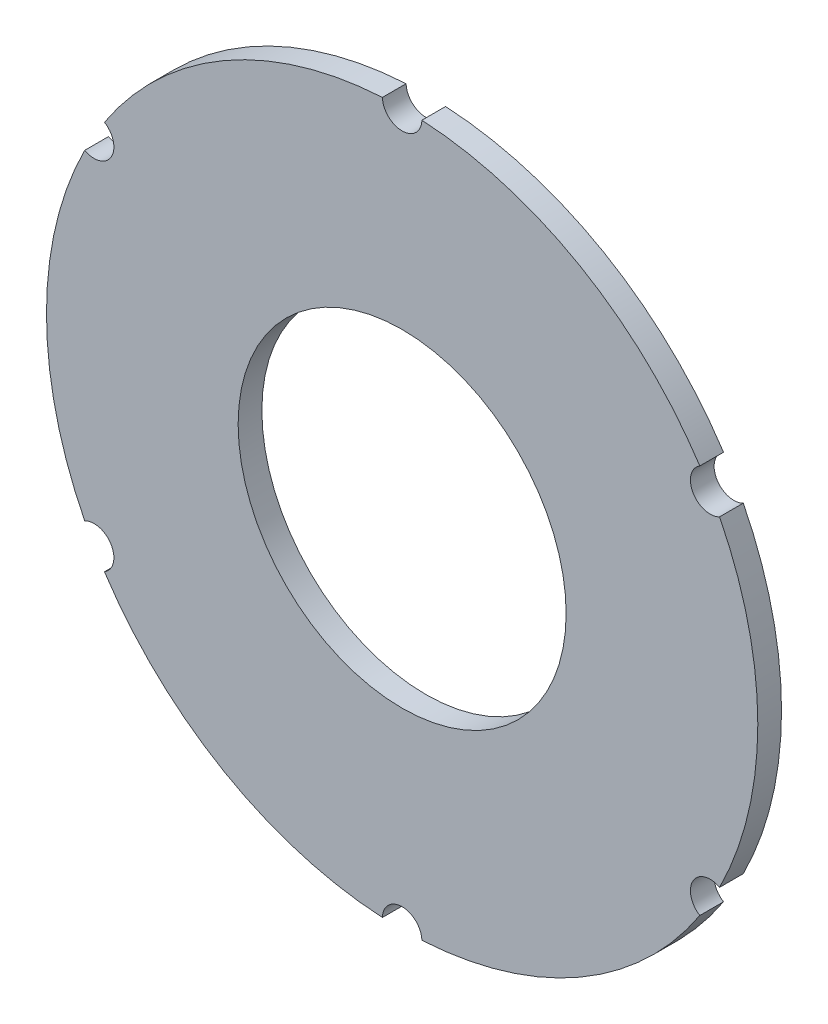
ISO-10303-21;
HEADER;
FILE_DESCRIPTION(('STEP AP214'),'2;1');
FILE_NAME('part.step','',(''),(''),'','','');
FILE_SCHEMA(('AUTOMOTIVE_DESIGN { 1 0 10303 214 1 1 1 1 }'));
ENDSEC;
DATA;
#1=APPLICATION_CONTEXT('core data for automotive mechanical design processes');
#2=APPLICATION_PROTOCOL_DEFINITION('international standard','automotive_design',2000,#1);
#3=PRODUCT_CONTEXT('',#1,'mechanical');
#4=PRODUCT('Part','Part','',(#3));
#5=PRODUCT_RELATED_PRODUCT_CATEGORY('part','',(#4));
#6=PRODUCT_DEFINITION_FORMATION('','',#4);
#7=PRODUCT_DEFINITION_CONTEXT('part definition',#1,'design');
#8=PRODUCT_DEFINITION('design','',#6,#7);
#9=PRODUCT_DEFINITION_SHAPE('','',#8);
#10=(LENGTH_UNIT() NAMED_UNIT(*) SI_UNIT(.MILLI.,.METRE.));
#11=(NAMED_UNIT(*) PLANE_ANGLE_UNIT() SI_UNIT($,.RADIAN.));
#12=(NAMED_UNIT(*) SI_UNIT($,.STERADIAN.) SOLID_ANGLE_UNIT());
#13=UNCERTAINTY_MEASURE_WITH_UNIT(LENGTH_MEASURE(1.E-05),#10,'distance_accuracy_value','');
#14=(GEOMETRIC_REPRESENTATION_CONTEXT(3) GLOBAL_UNCERTAINTY_ASSIGNED_CONTEXT((#13)) GLOBAL_UNIT_ASSIGNED_CONTEXT((#10,
#11,#12)) REPRESENTATION_CONTEXT('',''));
#15=CARTESIAN_POINT('',(0.,0.,0.));
#16=DIRECTION('',(0.,0.,1.));
#17=DIRECTION('',(1.,0.,0.));
#18=AXIS2_PLACEMENT_3D('',#15,#16,#17);
#19=CARTESIAN_POINT('',(0.,0.,0.));
#20=DIRECTION('',(0.,0.,1.));
#21=DIRECTION('',(1.,0.,0.));
#22=AXIS2_PLACEMENT_3D('',#19,#20,#21);
#23=PLANE('',#22);
#24=CARTESIAN_POINT('',(0.,0.,0.));
#25=DIRECTION('',(0.,0.,1.));
#26=DIRECTION('',(1.,0.,0.));
#27=AXIS2_PLACEMENT_3D('',#24,#25,#26);
#28=CIRCLE('',#27,41.5);
#29=CARTESIAN_POINT('',(41.5,0.,0.));
#30=VERTEX_POINT('',#29);
#31=EDGE_CURVE('E206',#30,#30,#28,.T.);
#32=ORIENTED_EDGE('',*,*,#31,.T.);
#33=EDGE_LOOP('',(#32));
#34=FACE_BOUND('',#33,.T.);
#35=CARTESIAN_POINT('',(77.9422863405996,44.9999999999998,0.));
#36=DIRECTION('',(0.,0.,-1.));
#37=DIRECTION('',(-1.,0.,0.));
#38=AXIS2_PLACEMENT_3D('',#35,#36,#37);
#39=CIRCLE('',#38,5.);
#40=CARTESIAN_POINT('',(80.3210403422193,40.6020994327089,0.));
#41=VERTEX_POINT('',#40);
#42=CARTESIAN_POINT('',(75.3229697268175,49.2590116784019,0.));
#43=VERTEX_POINT('',#42);
#44=EDGE_CURVE('E48',#41,#43,#39,.T.);
#45=ORIENTED_EDGE('',*,*,#44,.F.);
#46=CARTESIAN_POINT('',(0.,0.,0.));
#47=DIRECTION('',(0.,0.,1.));
#48=DIRECTION('',(1.,0.,0.));
#49=AXIS2_PLACEMENT_3D('',#46,#47,#48);
#50=CIRCLE('',#49,90.);
#51=CARTESIAN_POINT('',(80.3210403422193,-40.6020994327088,0.));
#52=VERTEX_POINT('',#51);
#53=EDGE_CURVE('E129',#52,#41,#50,.T.);
#54=ORIENTED_EDGE('',*,*,#53,.F.);
#55=CARTESIAN_POINT('',(77.9422863405996,-44.9999999999998,0.));
#56=DIRECTION('',(0.,0.,-1.));
#57=DIRECTION('',(-1.,0.,0.));
#58=AXIS2_PLACEMENT_3D('',#55,#56,#57);
#59=CIRCLE('',#58,5.);
#60=CARTESIAN_POINT('',(75.3229697268175,-49.2590116784019,0.));
#61=VERTEX_POINT('',#60);
#62=EDGE_CURVE('E56',#61,#52,#59,.T.);
#63=ORIENTED_EDGE('',*,*,#62,.F.);
#64=CARTESIAN_POINT('',(4.9980706154018,-89.8611111111111,0.));
#65=VERTEX_POINT('',#64);
#66=EDGE_CURVE('E135',#65,#61,#50,.T.);
#67=ORIENTED_EDGE('',*,*,#66,.F.);
#68=CARTESIAN_POINT('',(0.,-90.,0.));
#69=DIRECTION('',(0.,0.,-1.));
#70=DIRECTION('',(-1.,0.,0.));
#71=AXIS2_PLACEMENT_3D('',#68,#69,#70);
#72=CIRCLE('',#71,5.);
#73=CARTESIAN_POINT('',(-4.99807061540183,-89.8611111111111,0.));
#74=VERTEX_POINT('',#73);
#75=EDGE_CURVE('E190',#74,#65,#72,.T.);
#76=ORIENTED_EDGE('',*,*,#75,.F.);
#77=CARTESIAN_POINT('',(-75.3229697268175,-49.2590116784019,0.));
#78=VERTEX_POINT('',#77);
#79=EDGE_CURVE('E138',#78,#74,#50,.T.);
#80=ORIENTED_EDGE('',*,*,#79,.F.);
#81=CARTESIAN_POINT('',(-77.9422863405996,-44.9999999999998,0.));
#82=DIRECTION('',(0.,0.,-1.));
#83=DIRECTION('',(-1.,0.,0.));
#84=AXIS2_PLACEMENT_3D('',#81,#82,#83);
#85=CIRCLE('',#84,5.);
#86=CARTESIAN_POINT('',(-80.3210403422193,-40.6020994327088,0.));
#87=VERTEX_POINT('',#86);
#88=EDGE_CURVE('E194',#87,#78,#85,.T.);
#89=ORIENTED_EDGE('',*,*,#88,.F.);
#90=CARTESIAN_POINT('',(-80.3210403422193,40.6020994327089,0.));
#91=VERTEX_POINT('',#90);
#92=EDGE_CURVE('E145',#91,#87,#50,.T.);
#93=ORIENTED_EDGE('',*,*,#92,.F.);
#94=CARTESIAN_POINT('',(-77.9422863405996,44.9999999999998,0.));
#95=DIRECTION('',(0.,0.,-1.));
#96=DIRECTION('',(-1.,0.,0.));
#97=AXIS2_PLACEMENT_3D('',#94,#95,#96);
#98=CIRCLE('',#97,5.);
#99=CARTESIAN_POINT('',(-75.3229697268175,49.2590116784019,0.));
#100=VERTEX_POINT('',#99);
#101=EDGE_CURVE('E198',#100,#91,#98,.T.);
#102=ORIENTED_EDGE('',*,*,#101,.F.);
#103=CARTESIAN_POINT('',(-4.99807061540181,89.8611111111111,0.));
#104=VERTEX_POINT('',#103);
#105=EDGE_CURVE('E140',#104,#100,#50,.T.);
#106=ORIENTED_EDGE('',*,*,#105,.F.);
#107=CARTESIAN_POINT('',(0.,90.,0.));
#108=DIRECTION('',(0.,0.,-1.));
#109=DIRECTION('',(-1.,0.,0.));
#110=AXIS2_PLACEMENT_3D('',#107,#108,#109);
#111=CIRCLE('',#110,5.);
#112=CARTESIAN_POINT('',(4.99807061540184,89.8611111111111,0.));
#113=VERTEX_POINT('',#112);
#114=EDGE_CURVE('E202',#113,#104,#111,.T.);
#115=ORIENTED_EDGE('',*,*,#114,.F.);
#116=EDGE_CURVE('E131',#43,#113,#50,.T.);
#117=ORIENTED_EDGE('',*,*,#116,.F.);
#118=EDGE_LOOP('',(#45,#54,#63,#67,#76,#80,#89,#93,#102,#106,#115,#117));
#119=FACE_BOUND('',#118,.T.);
#120=ADVANCED_FACE('F33',(#34,#119),#23,.F.);
#121=CARTESIAN_POINT('',(0.,0.,6.));
#122=DIRECTION('',(0.,0.,-1.));
#123=DIRECTION('',(-1.,0.,0.));
#124=AXIS2_PLACEMENT_3D('',#121,#122,#123);
#125=CYLINDRICAL_SURFACE('',#124,90.);
#126=ORIENTED_EDGE('',*,*,#53,.T.);
#127=DIRECTION('',(0.,0.,-1.));
#128=VECTOR('',#127,1.);
#129=CARTESIAN_POINT('',(80.3210403422193,40.6020994327089,4.953));
#130=LINE('',#129,#128);
#131=CARTESIAN_POINT('',(80.3210403422193,40.6020994327088,6.));
#132=VERTEX_POINT('',#131);
#133=EDGE_CURVE('E11',#41,#132,#130,.F.);
#134=ORIENTED_EDGE('',*,*,#133,.T.);
#135=CARTESIAN_POINT('',(0.,0.,6.));
#136=DIRECTION('',(0.,0.,1.));
#137=DIRECTION('',(1.,0.,0.));
#138=AXIS2_PLACEMENT_3D('',#135,#136,#137);
#139=CIRCLE('',#138,90.);
#140=CARTESIAN_POINT('',(80.3210403422193,-40.6020994327088,6.));
#141=VERTEX_POINT('',#140);
#142=EDGE_CURVE('E184',#141,#132,#139,.T.);
#143=ORIENTED_EDGE('',*,*,#142,.F.);
#144=DIRECTION('',(0.,0.,-1.));
#145=VECTOR('',#144,1.);
#146=CARTESIAN_POINT('',(80.3210403422193,-40.6020994327088,4.953));
#147=LINE('',#146,#145);
#148=EDGE_CURVE('E134',#141,#52,#147,.T.);
#149=ORIENTED_EDGE('',*,*,#148,.T.);
#150=EDGE_LOOP('',(#126,#134,#143,#149));
#151=FACE_BOUND('',#150,.T.);
#152=ADVANCED_FACE('F133',(#151),#125,.T.);
#153=ORIENTED_EDGE('',*,*,#66,.T.);
#154=DIRECTION('',(0.,0.,-1.));
#155=VECTOR('',#154,1.);
#156=CARTESIAN_POINT('',(75.3229697268175,-49.2590116784019,4.953));
#157=LINE('',#156,#155);
#158=CARTESIAN_POINT('',(75.3229697268175,-49.2590116784019,6.));
#159=VERTEX_POINT('',#158);
#160=EDGE_CURVE('E173',#61,#159,#157,.F.);
#161=ORIENTED_EDGE('',*,*,#160,.T.);
#162=CARTESIAN_POINT('',(4.9980706154018,-89.8611111111111,6.));
#163=VERTEX_POINT('',#162);
#164=EDGE_CURVE('E257',#163,#159,#139,.T.);
#165=ORIENTED_EDGE('',*,*,#164,.F.);
#166=DIRECTION('',(0.,0.,-1.));
#167=VECTOR('',#166,1.);
#168=CARTESIAN_POINT('',(4.99807061540183,-89.8611111111111,4.953));
#169=LINE('',#168,#167);
#170=EDGE_CURVE('E166',#163,#65,#169,.T.);
#171=ORIENTED_EDGE('',*,*,#170,.T.);
#172=EDGE_LOOP('',(#153,#161,#165,#171));
#173=FACE_BOUND('',#172,.T.);
#174=ADVANCED_FACE('F230',(#173),#125,.T.);
#175=ORIENTED_EDGE('',*,*,#79,.T.);
#176=DIRECTION('',(0.,0.,-1.));
#177=VECTOR('',#176,1.);
#178=CARTESIAN_POINT('',(-4.99807061540183,-89.8611111111111,4.953));
#179=LINE('',#178,#177);
#180=CARTESIAN_POINT('',(-4.99807061540189,-89.8611111111111,6.));
#181=VERTEX_POINT('',#180);
#182=EDGE_CURVE('E169',#74,#181,#179,.F.);
#183=ORIENTED_EDGE('',*,*,#182,.T.);
#184=CARTESIAN_POINT('',(-75.3229697268175,-49.2590116784019,6.));
#185=VERTEX_POINT('',#184);
#186=EDGE_CURVE('E255',#185,#181,#139,.T.);
#187=ORIENTED_EDGE('',*,*,#186,.F.);
#188=DIRECTION('',(0.,0.,-1.));
#189=VECTOR('',#188,1.);
#190=CARTESIAN_POINT('',(-75.3229697268175,-49.2590116784019,4.953));
#191=LINE('',#190,#189);
#192=EDGE_CURVE('E160',#185,#78,#191,.T.);
#193=ORIENTED_EDGE('',*,*,#192,.T.);
#194=EDGE_LOOP('',(#175,#183,#187,#193));
#195=FACE_BOUND('',#194,.T.);
#196=ADVANCED_FACE('F240',(#195),#125,.T.);
#197=ORIENTED_EDGE('',*,*,#92,.T.);
#198=DIRECTION('',(0.,0.,-1.));
#199=VECTOR('',#198,1.);
#200=CARTESIAN_POINT('',(-80.3210403422193,-40.6020994327088,4.953));
#201=LINE('',#200,#199);
#202=CARTESIAN_POINT('',(-80.3210403422194,-40.6020994327088,6.));
#203=VERTEX_POINT('',#202);
#204=EDGE_CURVE('E163',#87,#203,#201,.F.);
#205=ORIENTED_EDGE('',*,*,#204,.T.);
#206=CARTESIAN_POINT('',(-80.3210403422193,40.6020994327089,6.));
#207=VERTEX_POINT('',#206);
#208=EDGE_CURVE('E253',#207,#203,#139,.T.);
#209=ORIENTED_EDGE('',*,*,#208,.F.);
#210=DIRECTION('',(0.,0.,-1.));
#211=VECTOR('',#210,1.);
#212=CARTESIAN_POINT('',(-80.3210403422193,40.6020994327089,4.953));
#213=LINE('',#212,#211);
#214=EDGE_CURVE('E154',#207,#91,#213,.T.);
#215=ORIENTED_EDGE('',*,*,#214,.T.);
#216=EDGE_LOOP('',(#197,#205,#209,#215));
#217=FACE_BOUND('',#216,.T.);
#218=ADVANCED_FACE('F235',(#217),#125,.T.);
#219=ORIENTED_EDGE('',*,*,#105,.T.);
#220=DIRECTION('',(0.,0.,-1.));
#221=VECTOR('',#220,1.);
#222=CARTESIAN_POINT('',(-75.3229697268175,49.2590116784019,4.953));
#223=LINE('',#222,#221);
#224=CARTESIAN_POINT('',(-75.3229697268175,49.2590116784019,6.));
#225=VERTEX_POINT('',#224);
#226=EDGE_CURVE('E157',#100,#225,#223,.F.);
#227=ORIENTED_EDGE('',*,*,#226,.T.);
#228=CARTESIAN_POINT('',(-4.99807061540181,89.8611111111111,6.));
#229=VERTEX_POINT('',#228);
#230=EDGE_CURVE('E146',#229,#225,#139,.T.);
#231=ORIENTED_EDGE('',*,*,#230,.F.);
#232=DIRECTION('',(0.,0.,-1.));
#233=VECTOR('',#232,1.);
#234=CARTESIAN_POINT('',(-4.99807061540182,89.8611111111111,4.953));
#235=LINE('',#234,#233);
#236=EDGE_CURVE('E148',#229,#104,#235,.T.);
#237=ORIENTED_EDGE('',*,*,#236,.T.);
#238=EDGE_LOOP('',(#219,#227,#231,#237));
#239=FACE_BOUND('',#238,.T.);
#240=ADVANCED_FACE('F224',(#239),#125,.T.);
#241=CARTESIAN_POINT('',(0.,0.,6.));
#242=DIRECTION('',(0.,0.,1.));
#243=DIRECTION('',(1.,0.,0.));
#244=AXIS2_PLACEMENT_3D('',#241,#242,#243);
#245=PLANE('',#244);
#246=CARTESIAN_POINT('',(77.9422863405996,44.9999999999998,6.));
#247=DIRECTION('',(0.,0.,1.));
#248=DIRECTION('',(1.,0.,0.));
#249=AXIS2_PLACEMENT_3D('',#246,#247,#248);
#250=CIRCLE('',#249,5.);
#251=CARTESIAN_POINT('',(75.3229697268175,49.2590116784019,6.));
#252=VERTEX_POINT('',#251);
#253=EDGE_CURVE('E121',#252,#132,#250,.T.);
#254=ORIENTED_EDGE('',*,*,#253,.F.);
#255=CARTESIAN_POINT('',(4.9980706154019,89.8611111111111,6.));
#256=VERTEX_POINT('',#255);
#257=EDGE_CURVE('E144',#252,#256,#139,.T.);
#258=ORIENTED_EDGE('',*,*,#257,.T.);
#259=CARTESIAN_POINT('',(0.,90.,6.));
#260=DIRECTION('',(0.,0.,1.));
#261=DIRECTION('',(1.,0.,0.));
#262=AXIS2_PLACEMENT_3D('',#259,#260,#261);
#263=CIRCLE('',#262,5.);
#264=EDGE_CURVE('E204',#229,#256,#263,.T.);
#265=ORIENTED_EDGE('',*,*,#264,.F.);
#266=ORIENTED_EDGE('',*,*,#230,.T.);
#267=CARTESIAN_POINT('',(-77.9422863405996,44.9999999999998,6.));
#268=DIRECTION('',(0.,0.,1.));
#269=DIRECTION('',(1.,0.,0.));
#270=AXIS2_PLACEMENT_3D('',#267,#268,#269);
#271=CIRCLE('',#270,5.);
#272=EDGE_CURVE('E200',#207,#225,#271,.T.);
#273=ORIENTED_EDGE('',*,*,#272,.F.);
#274=ORIENTED_EDGE('',*,*,#208,.T.);
#275=CARTESIAN_POINT('',(-77.9422863405996,-44.9999999999998,6.));
#276=DIRECTION('',(0.,0.,1.));
#277=DIRECTION('',(1.,0.,0.));
#278=AXIS2_PLACEMENT_3D('',#275,#276,#277);
#279=CIRCLE('',#278,5.);
#280=EDGE_CURVE('E196',#185,#203,#279,.T.);
#281=ORIENTED_EDGE('',*,*,#280,.F.);
#282=ORIENTED_EDGE('',*,*,#186,.T.);
#283=CARTESIAN_POINT('',(0.,-90.,6.));
#284=DIRECTION('',(0.,0.,1.));
#285=DIRECTION('',(1.,0.,0.));
#286=AXIS2_PLACEMENT_3D('',#283,#284,#285);
#287=CIRCLE('',#286,5.);
#288=EDGE_CURVE('E192',#163,#181,#287,.T.);
#289=ORIENTED_EDGE('',*,*,#288,.F.);
#290=ORIENTED_EDGE('',*,*,#164,.T.);
#291=CARTESIAN_POINT('',(77.9422863405996,-44.9999999999998,6.));
#292=DIRECTION('',(0.,0.,1.));
#293=DIRECTION('',(1.,0.,0.));
#294=AXIS2_PLACEMENT_3D('',#291,#292,#293);
#295=CIRCLE('',#294,5.);
#296=EDGE_CURVE('E186',#141,#159,#295,.T.);
#297=ORIENTED_EDGE('',*,*,#296,.F.);
#298=ORIENTED_EDGE('',*,*,#142,.T.);
#299=EDGE_LOOP('',(#254,#258,#265,#266,#273,#274,#281,#282,#289,#290,#297,#298));
#300=FACE_BOUND('',#299,.T.);
#301=CARTESIAN_POINT('',(0.,0.,6.));
#302=DIRECTION('',(0.,0.,1.));
#303=DIRECTION('',(1.,0.,0.));
#304=AXIS2_PLACEMENT_3D('',#301,#302,#303);
#305=CIRCLE('',#304,41.5);
#306=CARTESIAN_POINT('',(41.5,0.,6.));
#307=VERTEX_POINT('',#306);
#308=EDGE_CURVE('E139',#307,#307,#305,.T.);
#309=ORIENTED_EDGE('',*,*,#308,.F.);
#310=EDGE_LOOP('',(#309));
#311=FACE_BOUND('',#310,.T.);
#312=ADVANCED_FACE('F179',(#300,#311),#245,.T.);
#313=ORIENTED_EDGE('',*,*,#257,.F.);
#314=DIRECTION('',(0.,0.,-1.));
#315=VECTOR('',#314,1.);
#316=CARTESIAN_POINT('',(75.3229697268175,49.2590116784019,4.953));
#317=LINE('',#316,#315);
#318=EDGE_CURVE('E41',#252,#43,#317,.T.);
#319=ORIENTED_EDGE('',*,*,#318,.T.);
#320=ORIENTED_EDGE('',*,*,#116,.T.);
#321=DIRECTION('',(0.,0.,-1.));
#322=VECTOR('',#321,1.);
#323=CARTESIAN_POINT('',(4.99807061540184,89.8611111111111,4.953));
#324=LINE('',#323,#322);
#325=EDGE_CURVE('E151',#113,#256,#324,.F.);
#326=ORIENTED_EDGE('',*,*,#325,.T.);
#327=EDGE_LOOP('',(#313,#319,#320,#326));
#328=FACE_BOUND('',#327,.T.);
#329=ADVANCED_FACE('F35',(#328),#125,.T.);
#330=CARTESIAN_POINT('',(0.,0.,6.));
#331=DIRECTION('',(0.,0.,-1.));
#332=DIRECTION('',(-1.,0.,0.));
#333=AXIS2_PLACEMENT_3D('',#330,#331,#332);
#334=CYLINDRICAL_SURFACE('',#333,41.5);
#335=ORIENTED_EDGE('',*,*,#308,.T.);
#336=EDGE_LOOP('',(#335));
#337=FACE_BOUND('',#336,.T.);
#338=ORIENTED_EDGE('',*,*,#31,.F.);
#339=EDGE_LOOP('',(#338));
#340=FACE_BOUND('',#339,.T.);
#341=ADVANCED_FACE('F212',(#337,#340),#334,.F.);
#342=CARTESIAN_POINT('',(0.,90.,0.));
#343=DIRECTION('',(0.,0.,-1.));
#344=DIRECTION('',(-1.,0.,0.));
#345=AXIS2_PLACEMENT_3D('',#342,#343,#344);
#346=CYLINDRICAL_SURFACE('',#345,5.);
#347=ORIENTED_EDGE('',*,*,#114,.T.);
#348=ORIENTED_EDGE('',*,*,#236,.F.);
#349=ORIENTED_EDGE('',*,*,#264,.T.);
#350=ORIENTED_EDGE('',*,*,#325,.F.);
#351=EDGE_LOOP('',(#347,#348,#349,#350));
#352=FACE_BOUND('',#351,.T.);
#353=ADVANCED_FACE('F214',(#352),#346,.F.);
#354=CARTESIAN_POINT('',(-77.9422863405996,44.9999999999998,0.));
#355=DIRECTION('',(0.,0.,-1.));
#356=DIRECTION('',(-1.,0.,0.));
#357=AXIS2_PLACEMENT_3D('',#354,#355,#356);
#358=CYLINDRICAL_SURFACE('',#357,5.);
#359=ORIENTED_EDGE('',*,*,#101,.T.);
#360=ORIENTED_EDGE('',*,*,#214,.F.);
#361=ORIENTED_EDGE('',*,*,#272,.T.);
#362=ORIENTED_EDGE('',*,*,#226,.F.);
#363=EDGE_LOOP('',(#359,#360,#361,#362));
#364=FACE_BOUND('',#363,.T.);
#365=ADVANCED_FACE('F221',(#364),#358,.F.);
#366=CARTESIAN_POINT('',(-77.9422863405996,-44.9999999999998,0.));
#367=DIRECTION('',(0.,0.,-1.));
#368=DIRECTION('',(-1.,0.,0.));
#369=AXIS2_PLACEMENT_3D('',#366,#367,#368);
#370=CYLINDRICAL_SURFACE('',#369,5.);
#371=ORIENTED_EDGE('',*,*,#88,.T.);
#372=ORIENTED_EDGE('',*,*,#192,.F.);
#373=ORIENTED_EDGE('',*,*,#280,.T.);
#374=ORIENTED_EDGE('',*,*,#204,.F.);
#375=EDGE_LOOP('',(#371,#372,#373,#374));
#376=FACE_BOUND('',#375,.T.);
#377=ADVANCED_FACE('F271',(#376),#370,.F.);
#378=CARTESIAN_POINT('',(0.,-90.,0.));
#379=DIRECTION('',(0.,0.,-1.));
#380=DIRECTION('',(-1.,0.,0.));
#381=AXIS2_PLACEMENT_3D('',#378,#379,#380);
#382=CYLINDRICAL_SURFACE('',#381,5.);
#383=ORIENTED_EDGE('',*,*,#75,.T.);
#384=ORIENTED_EDGE('',*,*,#170,.F.);
#385=ORIENTED_EDGE('',*,*,#288,.T.);
#386=ORIENTED_EDGE('',*,*,#182,.F.);
#387=EDGE_LOOP('',(#383,#384,#385,#386));
#388=FACE_BOUND('',#387,.T.);
#389=ADVANCED_FACE('F273',(#388),#382,.F.);
#390=CARTESIAN_POINT('',(77.9422863405996,-44.9999999999998,0.));
#391=DIRECTION('',(0.,0.,-1.));
#392=DIRECTION('',(-1.,0.,0.));
#393=AXIS2_PLACEMENT_3D('',#390,#391,#392);
#394=CYLINDRICAL_SURFACE('',#393,5.);
#395=ORIENTED_EDGE('',*,*,#62,.T.);
#396=ORIENTED_EDGE('',*,*,#148,.F.);
#397=ORIENTED_EDGE('',*,*,#296,.T.);
#398=ORIENTED_EDGE('',*,*,#160,.F.);
#399=EDGE_LOOP('',(#395,#396,#397,#398));
#400=FACE_BOUND('',#399,.T.);
#401=ADVANCED_FACE('F264',(#400),#394,.F.);
#402=CARTESIAN_POINT('',(77.9422863405996,44.9999999999998,0.));
#403=DIRECTION('',(0.,0.,-1.));
#404=DIRECTION('',(-1.,0.,0.));
#405=AXIS2_PLACEMENT_3D('',#402,#403,#404);
#406=CYLINDRICAL_SURFACE('',#405,5.);
#407=ORIENTED_EDGE('',*,*,#44,.T.);
#408=ORIENTED_EDGE('',*,*,#318,.F.);
#409=ORIENTED_EDGE('',*,*,#253,.T.);
#410=ORIENTED_EDGE('',*,*,#133,.F.);
#411=EDGE_LOOP('',(#407,#408,#409,#410));
#412=FACE_BOUND('',#411,.T.);
#413=ADVANCED_FACE('F119',(#412),#406,.F.);
#414=CLOSED_SHELL('',(#120,#152,#174,#196,#218,#240,#312,#329,#341,#353,#365,#377,#389,#401,#413));
#415=MANIFOLD_SOLID_BREP('B2',#414);
#416=ADVANCED_BREP_SHAPE_REPRESENTATION('',(#18,#415),#14);
#417=SHAPE_DEFINITION_REPRESENTATION(#9,#416);
ENDSEC;
END-ISO-10303-21;
